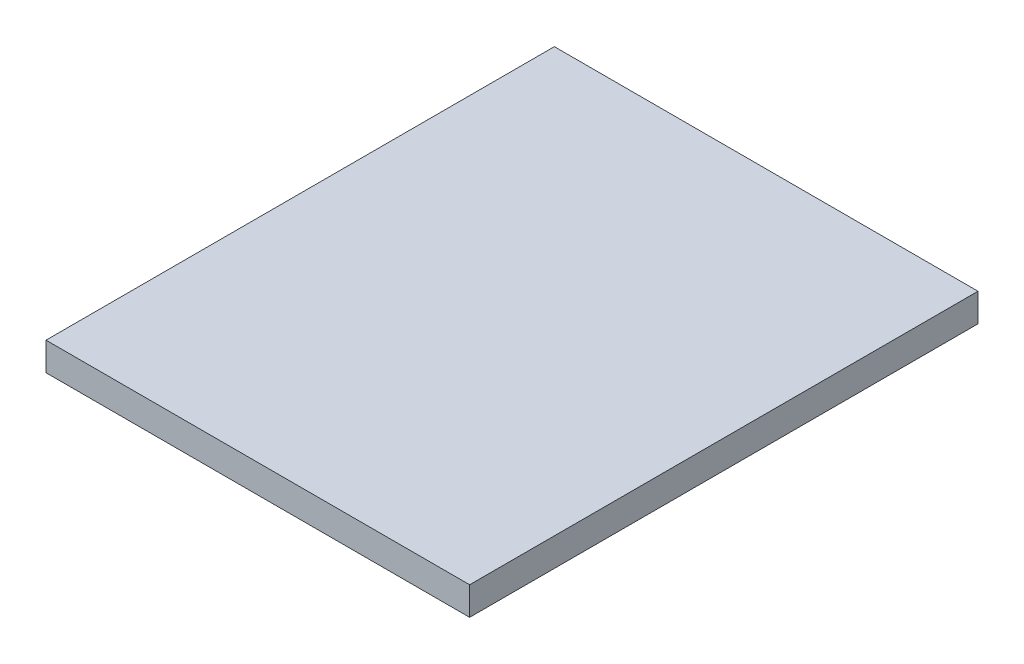
ISO-10303-21;
HEADER;
FILE_DESCRIPTION(('STEP AP214'),'2;1');
FILE_NAME('part.step','',(''),(''),'','','');
FILE_SCHEMA(('AUTOMOTIVE_DESIGN { 1 0 10303 214 1 1 1 1 }'));
ENDSEC;
DATA;
#1=APPLICATION_CONTEXT('core data for automotive mechanical design processes');
#2=APPLICATION_PROTOCOL_DEFINITION('international standard','automotive_design',2000,#1);
#3=PRODUCT_CONTEXT('',#1,'mechanical');
#4=PRODUCT('Part','Part','',(#3));
#5=PRODUCT_RELATED_PRODUCT_CATEGORY('part','',(#4));
#6=PRODUCT_DEFINITION_FORMATION('','',#4);
#7=PRODUCT_DEFINITION_CONTEXT('part definition',#1,'design');
#8=PRODUCT_DEFINITION('design','',#6,#7);
#9=PRODUCT_DEFINITION_SHAPE('','',#8);
#10=(LENGTH_UNIT() NAMED_UNIT(*) SI_UNIT(.MILLI.,.METRE.));
#11=(NAMED_UNIT(*) PLANE_ANGLE_UNIT() SI_UNIT($,.RADIAN.));
#12=(NAMED_UNIT(*) SI_UNIT($,.STERADIAN.) SOLID_ANGLE_UNIT());
#13=UNCERTAINTY_MEASURE_WITH_UNIT(LENGTH_MEASURE(1.E-05),#10,'distance_accuracy_value','');
#14=(GEOMETRIC_REPRESENTATION_CONTEXT(3) GLOBAL_UNCERTAINTY_ASSIGNED_CONTEXT((#13)) GLOBAL_UNIT_ASSIGNED_CONTEXT((#10,
#11,#12)) REPRESENTATION_CONTEXT('',''));
#15=CARTESIAN_POINT('',(0.,0.,0.));
#16=DIRECTION('',(0.,0.,1.));
#17=DIRECTION('',(1.,0.,0.));
#18=AXIS2_PLACEMENT_3D('',#15,#16,#17);
#19=CARTESIAN_POINT('',(45.,5.99999999999996,54.));
#20=DIRECTION('',(-1.,0.,0.));
#21=DIRECTION('',(0.,0.,1.));
#22=AXIS2_PLACEMENT_3D('',#19,#20,#21);
#23=PLANE('',#22);
#24=DIRECTION('',(0.,0.,-1.));
#25=VECTOR('',#24,1.);
#26=CARTESIAN_POINT('',(45.,0.,54.));
#27=LINE('',#26,#25);
#28=CARTESIAN_POINT('',(45.,0.,54.));
#29=VERTEX_POINT('',#28);
#30=CARTESIAN_POINT('',(45.,0.,-54.));
#31=VERTEX_POINT('',#30);
#32=EDGE_CURVE('E95',#29,#31,#27,.T.);
#33=ORIENTED_EDGE('',*,*,#32,.T.);
#34=DIRECTION('',(0.,-1.,0.));
#35=VECTOR('',#34,1.);
#36=CARTESIAN_POINT('',(45.,5.99999999999996,-54.));
#37=LINE('',#36,#35);
#38=CARTESIAN_POINT('',(45.,5.99999999999996,-54.));
#39=VERTEX_POINT('',#38);
#40=EDGE_CURVE('E11',#39,#31,#37,.T.);
#41=ORIENTED_EDGE('',*,*,#40,.F.);
#42=DIRECTION('',(0.,0.,-1.));
#43=VECTOR('',#42,1.);
#44=CARTESIAN_POINT('',(45.,5.99999999999996,54.));
#45=LINE('',#44,#43);
#46=CARTESIAN_POINT('',(45.,5.99999999999996,54.));
#47=VERTEX_POINT('',#46);
#48=EDGE_CURVE('E83',#47,#39,#45,.T.);
#49=ORIENTED_EDGE('',*,*,#48,.F.);
#50=DIRECTION('',(0.,-1.,0.));
#51=VECTOR('',#50,1.);
#52=CARTESIAN_POINT('',(45.,5.99999999999996,54.));
#53=LINE('',#52,#51);
#54=EDGE_CURVE('E91',#47,#29,#53,.T.);
#55=ORIENTED_EDGE('',*,*,#54,.T.);
#56=EDGE_LOOP('',(#33,#41,#49,#55));
#57=FACE_BOUND('',#56,.T.);
#58=ADVANCED_FACE('F32',(#57),#23,.F.);
#59=CARTESIAN_POINT('',(-45.,6.00000000000001,-54.));
#60=DIRECTION('',(0.,0.,1.));
#61=DIRECTION('',(1.,0.,0.));
#62=AXIS2_PLACEMENT_3D('',#59,#60,#61);
#63=PLANE('',#62);
#64=DIRECTION('',(-1.,0.,0.));
#65=VECTOR('',#64,1.);
#66=CARTESIAN_POINT('',(-45.,0.,-54.));
#67=LINE('',#66,#65);
#68=CARTESIAN_POINT('',(-45.,0.,-54.));
#69=VERTEX_POINT('',#68);
#70=EDGE_CURVE('E87',#31,#69,#67,.T.);
#71=ORIENTED_EDGE('',*,*,#70,.T.);
#72=DIRECTION('',(0.,-1.,0.));
#73=VECTOR('',#72,1.);
#74=CARTESIAN_POINT('',(-45.,6.00000000000001,-54.));
#75=LINE('',#74,#73);
#76=CARTESIAN_POINT('',(-45.,6.00000000000001,-54.));
#77=VERTEX_POINT('',#76);
#78=EDGE_CURVE('E40',#77,#69,#75,.T.);
#79=ORIENTED_EDGE('',*,*,#78,.F.);
#80=DIRECTION('',(-1.,0.,0.));
#81=VECTOR('',#80,1.);
#82=CARTESIAN_POINT('',(-45.,6.00000000000001,-54.));
#83=LINE('',#82,#81);
#84=EDGE_CURVE('E78',#39,#77,#83,.T.);
#85=ORIENTED_EDGE('',*,*,#84,.F.);
#86=ORIENTED_EDGE('',*,*,#40,.T.);
#87=EDGE_LOOP('',(#71,#79,#85,#86));
#88=FACE_BOUND('',#87,.T.);
#89=ADVANCED_FACE('F86',(#88),#63,.F.);
#90=CARTESIAN_POINT('',(-45.,6.00000000000001,54.));
#91=DIRECTION('',(1.,0.,0.));
#92=DIRECTION('',(0.,0.,-1.));
#93=AXIS2_PLACEMENT_3D('',#90,#91,#92);
#94=PLANE('',#93);
#95=DIRECTION('',(0.,0.,1.));
#96=VECTOR('',#95,1.);
#97=CARTESIAN_POINT('',(-45.,0.,54.));
#98=LINE('',#97,#96);
#99=CARTESIAN_POINT('',(-45.,0.,54.));
#100=VERTEX_POINT('',#99);
#101=EDGE_CURVE('E65',#69,#100,#98,.T.);
#102=ORIENTED_EDGE('',*,*,#101,.T.);
#103=DIRECTION('',(0.,-1.,0.));
#104=VECTOR('',#103,1.);
#105=CARTESIAN_POINT('',(-45.,6.00000000000001,54.));
#106=LINE('',#105,#104);
#107=CARTESIAN_POINT('',(-45.,6.00000000000001,54.));
#108=VERTEX_POINT('',#107);
#109=EDGE_CURVE('E88',#108,#100,#106,.T.);
#110=ORIENTED_EDGE('',*,*,#109,.F.);
#111=DIRECTION('',(0.,0.,1.));
#112=VECTOR('',#111,1.);
#113=CARTESIAN_POINT('',(-45.,6.00000000000001,54.));
#114=LINE('',#113,#112);
#115=EDGE_CURVE('E81',#77,#108,#114,.T.);
#116=ORIENTED_EDGE('',*,*,#115,.F.);
#117=ORIENTED_EDGE('',*,*,#78,.T.);
#118=EDGE_LOOP('',(#102,#110,#116,#117));
#119=FACE_BOUND('',#118,.T.);
#120=ADVANCED_FACE('F89',(#119),#94,.F.);
#121=CARTESIAN_POINT('',(-45.,6.00000000000001,54.));
#122=DIRECTION('',(0.,0.,-1.));
#123=DIRECTION('',(-1.,0.,0.));
#124=AXIS2_PLACEMENT_3D('',#121,#122,#123);
#125=PLANE('',#124);
#126=DIRECTION('',(1.,0.,0.));
#127=VECTOR('',#126,1.);
#128=CARTESIAN_POINT('',(-45.,0.,54.));
#129=LINE('',#128,#127);
#130=EDGE_CURVE('E71',#100,#29,#129,.T.);
#131=ORIENTED_EDGE('',*,*,#130,.T.);
#132=ORIENTED_EDGE('',*,*,#54,.F.);
#133=DIRECTION('',(1.,0.,0.));
#134=VECTOR('',#133,1.);
#135=CARTESIAN_POINT('',(-45.,6.00000000000001,54.));
#136=LINE('',#135,#134);
#137=EDGE_CURVE('E48',#108,#47,#136,.T.);
#138=ORIENTED_EDGE('',*,*,#137,.F.);
#139=ORIENTED_EDGE('',*,*,#109,.T.);
#140=EDGE_LOOP('',(#131,#132,#138,#139));
#141=FACE_BOUND('',#140,.T.);
#142=ADVANCED_FACE('F102',(#141),#125,.F.);
#143=CARTESIAN_POINT('',(0.,5.99999999999996,0.));
#144=DIRECTION('',(0.,-1.,0.));
#145=DIRECTION('',(0.,0.,-1.));
#146=AXIS2_PLACEMENT_3D('',#143,#144,#145);
#147=PLANE('',#146);
#148=ORIENTED_EDGE('',*,*,#48,.T.);
#149=ORIENTED_EDGE('',*,*,#84,.T.);
#150=ORIENTED_EDGE('',*,*,#115,.T.);
#151=ORIENTED_EDGE('',*,*,#137,.T.);
#152=EDGE_LOOP('',(#148,#149,#150,#151));
#153=FACE_BOUND('',#152,.T.);
#154=ADVANCED_FACE('F79',(#153),#147,.F.);
#155=CARTESIAN_POINT('',(0.,0.,0.));
#156=DIRECTION('',(0.,-1.,0.));
#157=DIRECTION('',(0.,0.,-1.));
#158=AXIS2_PLACEMENT_3D('',#155,#156,#157);
#159=PLANE('',#158);
#160=ORIENTED_EDGE('',*,*,#32,.F.);
#161=ORIENTED_EDGE('',*,*,#130,.F.);
#162=ORIENTED_EDGE('',*,*,#101,.F.);
#163=ORIENTED_EDGE('',*,*,#70,.F.);
#164=EDGE_LOOP('',(#160,#161,#162,#163));
#165=FACE_BOUND('',#164,.T.);
#166=ADVANCED_FACE('F105',(#165),#159,.T.);
#167=CLOSED_SHELL('',(#58,#89,#120,#142,#154,#166));
#168=MANIFOLD_SOLID_BREP('B2',#167);
#169=ADVANCED_BREP_SHAPE_REPRESENTATION('',(#18,#168),#14);
#170=SHAPE_DEFINITION_REPRESENTATION(#9,#169);
ENDSEC;
END-ISO-10303-21;
